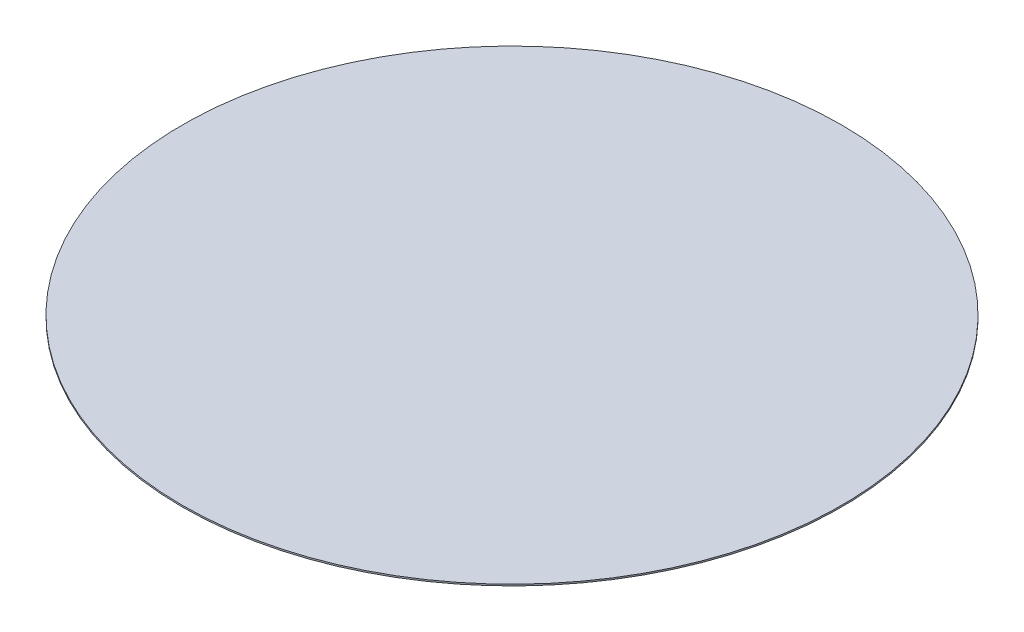
ISO-10303-21;
HEADER;
FILE_DESCRIPTION(('STEP AP214'),'2;1');
FILE_NAME('part.step','',(''),(''),'','','');
FILE_SCHEMA(('AUTOMOTIVE_DESIGN { 1 0 10303 214 1 1 1 1 }'));
ENDSEC;
DATA;
#1=APPLICATION_CONTEXT('core data for automotive mechanical design processes');
#2=APPLICATION_PROTOCOL_DEFINITION('international standard','automotive_design',2000,#1);
#3=PRODUCT_CONTEXT('',#1,'mechanical');
#4=PRODUCT('Part','Part','',(#3));
#5=PRODUCT_RELATED_PRODUCT_CATEGORY('part','',(#4));
#6=PRODUCT_DEFINITION_FORMATION('','',#4);
#7=PRODUCT_DEFINITION_CONTEXT('part definition',#1,'design');
#8=PRODUCT_DEFINITION('design','',#6,#7);
#9=PRODUCT_DEFINITION_SHAPE('','',#8);
#10=(LENGTH_UNIT() NAMED_UNIT(*) SI_UNIT(.MILLI.,.METRE.));
#11=(NAMED_UNIT(*) PLANE_ANGLE_UNIT() SI_UNIT($,.RADIAN.));
#12=(NAMED_UNIT(*) SI_UNIT($,.STERADIAN.) SOLID_ANGLE_UNIT());
#13=UNCERTAINTY_MEASURE_WITH_UNIT(LENGTH_MEASURE(1.E-05),#10,'distance_accuracy_value','');
#14=(GEOMETRIC_REPRESENTATION_CONTEXT(3) GLOBAL_UNCERTAINTY_ASSIGNED_CONTEXT((#13)) GLOBAL_UNIT_ASSIGNED_CONTEXT((#10,
#11,#12)) REPRESENTATION_CONTEXT('',''));
#15=CARTESIAN_POINT('',(0.,0.,0.));
#16=DIRECTION('',(0.,0.,1.));
#17=DIRECTION('',(1.,0.,0.));
#18=AXIS2_PLACEMENT_3D('',#15,#16,#17);
#19=CARTESIAN_POINT('',(0.,2.54,0.));
#20=DIRECTION('',(0.,-1.,0.));
#21=DIRECTION('',(0.,0.,-1.));
#22=AXIS2_PLACEMENT_3D('',#19,#20,#21);
#23=CYLINDRICAL_SURFACE('',#22,550.164);
#24=CARTESIAN_POINT('',(0.,2.54,0.));
#25=DIRECTION('',(0.,1.,0.));
#26=DIRECTION('',(0.,0.,1.));
#27=AXIS2_PLACEMENT_3D('',#24,#25,#26);
#28=CIRCLE('',#27,550.164);
#29=CARTESIAN_POINT('',(0.,2.54,550.164));
#30=VERTEX_POINT('',#29);
#31=EDGE_CURVE('E10',#30,#30,#28,.T.);
#32=ORIENTED_EDGE('',*,*,#31,.F.);
#33=EDGE_LOOP('',(#32));
#34=FACE_BOUND('',#33,.T.);
#35=CARTESIAN_POINT('',(0.,0.,0.));
#36=DIRECTION('',(0.,1.,0.));
#37=DIRECTION('',(0.,0.,1.));
#38=AXIS2_PLACEMENT_3D('',#35,#36,#37);
#39=CIRCLE('',#38,550.164);
#40=CARTESIAN_POINT('',(0.,0.,550.164));
#41=VERTEX_POINT('',#40);
#42=EDGE_CURVE('E40',#41,#41,#39,.T.);
#43=ORIENTED_EDGE('',*,*,#42,.T.);
#44=EDGE_LOOP('',(#43));
#45=FACE_BOUND('',#44,.T.);
#46=ADVANCED_FACE('F37',(#34,#45),#23,.T.);
#47=CARTESIAN_POINT('',(0.,2.54,0.));
#48=DIRECTION('',(0.,1.,0.));
#49=DIRECTION('',(0.,0.,1.));
#50=AXIS2_PLACEMENT_3D('',#47,#48,#49);
#51=PLANE('',#50);
#52=ORIENTED_EDGE('',*,*,#31,.T.);
#53=EDGE_LOOP('',(#52));
#54=FACE_BOUND('',#53,.T.);
#55=ADVANCED_FACE('F54',(#54),#51,.T.);
#56=CARTESIAN_POINT('',(0.,0.,0.));
#57=DIRECTION('',(0.,1.,0.));
#58=DIRECTION('',(0.,0.,1.));
#59=AXIS2_PLACEMENT_3D('',#56,#57,#58);
#60=PLANE('',#59);
#61=ORIENTED_EDGE('',*,*,#42,.F.);
#62=EDGE_LOOP('',(#61));
#63=FACE_BOUND('',#62,.T.);
#64=ADVANCED_FACE('F52',(#63),#60,.F.);
#65=CLOSED_SHELL('',(#46,#55,#64));
#66=MANIFOLD_SOLID_BREP('B2',#65);
#67=ADVANCED_BREP_SHAPE_REPRESENTATION('',(#18,#66),#14);
#68=SHAPE_DEFINITION_REPRESENTATION(#9,#67);
ENDSEC;
END-ISO-10303-21;
